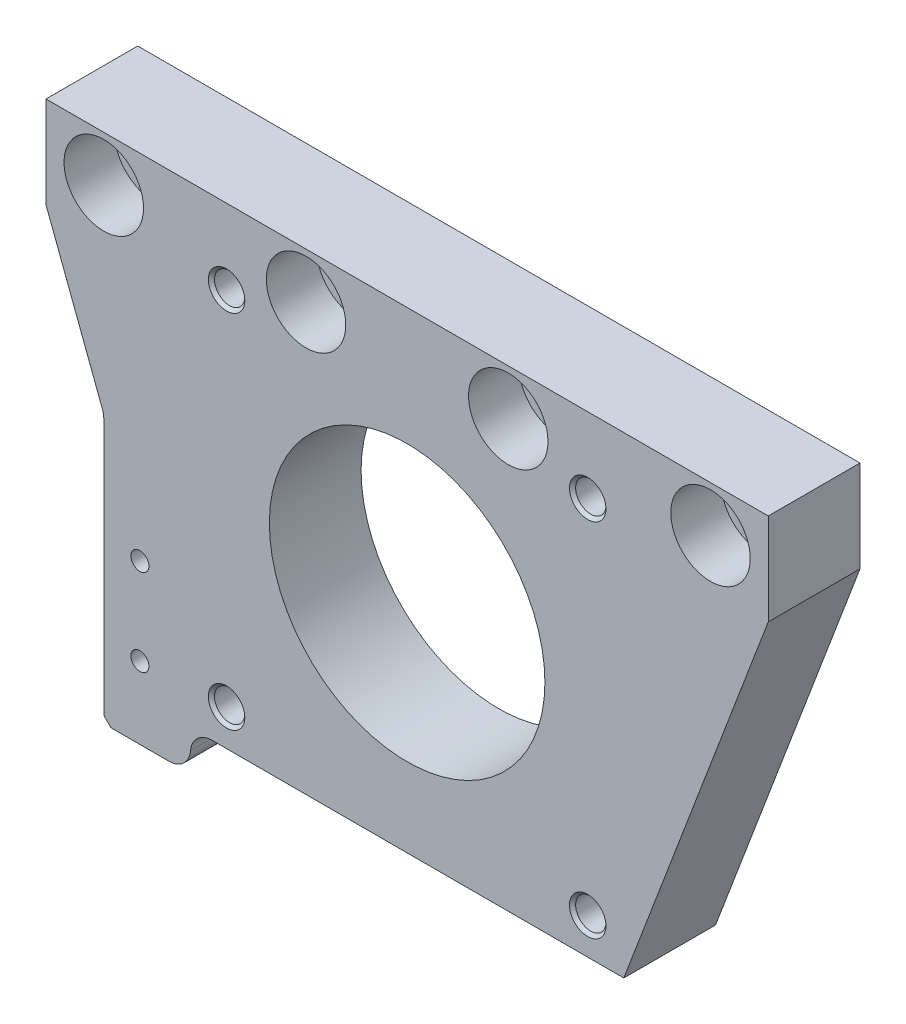
ISO-10303-21;
HEADER;
FILE_DESCRIPTION(('STEP AP214'),'2;1');
FILE_NAME('part.step','',(''),(''),'','','');
FILE_SCHEMA(('AUTOMOTIVE_DESIGN { 1 0 10303 214 1 1 1 1 }'));
ENDSEC;
DATA;
#1=APPLICATION_CONTEXT('core data for automotive mechanical design processes');
#2=APPLICATION_PROTOCOL_DEFINITION('international standard','automotive_design',2000,#1);
#3=PRODUCT_CONTEXT('',#1,'mechanical');
#4=PRODUCT('Part','Part','',(#3));
#5=PRODUCT_RELATED_PRODUCT_CATEGORY('part','',(#4));
#6=PRODUCT_DEFINITION_FORMATION('','',#4);
#7=PRODUCT_DEFINITION_CONTEXT('part definition',#1,'design');
#8=PRODUCT_DEFINITION('design','',#6,#7);
#9=PRODUCT_DEFINITION_SHAPE('','',#8);
#10=(LENGTH_UNIT() NAMED_UNIT(*) SI_UNIT(.MILLI.,.METRE.));
#11=(NAMED_UNIT(*) PLANE_ANGLE_UNIT() SI_UNIT($,.RADIAN.));
#12=(NAMED_UNIT(*) SI_UNIT($,.STERADIAN.) SOLID_ANGLE_UNIT());
#13=UNCERTAINTY_MEASURE_WITH_UNIT(LENGTH_MEASURE(1.E-05),#10,'distance_accuracy_value','');
#14=(GEOMETRIC_REPRESENTATION_CONTEXT(3) GLOBAL_UNCERTAINTY_ASSIGNED_CONTEXT((#13)) GLOBAL_UNIT_ASSIGNED_CONTEXT((#10,
#11,#12)) REPRESENTATION_CONTEXT('',''));
#15=CARTESIAN_POINT('',(0.,0.,0.));
#16=DIRECTION('',(0.,0.,1.));
#17=DIRECTION('',(1.,0.,0.));
#18=AXIS2_PLACEMENT_3D('',#15,#16,#17);
#19=CARTESIAN_POINT('',(-50.0000000000009,22.7000000000002,-12.6999999999999));
#20=DIRECTION('',(-0.934936655566325,-0.354814670044142,0.));
#21=DIRECTION('',(0.354814670044142,-0.934936655566325,0.));
#22=AXIS2_PLACEMENT_3D('',#19,#20,#21);
#23=PLANE('',#22);
#24=DIRECTION('',(0.354814670044142,-0.934936655566325,0.));
#25=VECTOR('',#24,1.);
#26=CARTESIAN_POINT('',(-50.0000000000009,22.7000000000002,-12.6999999999999));
#27=LINE('',#26,#25);
#28=CARTESIAN_POINT('',(-50.0000000000009,22.7000000000002,-12.6999999999999));
#29=VERTEX_POINT('',#28);
#30=CARTESIAN_POINT('',(-42.1951900333016,2.13432573774847,-12.6999999999999));
#31=VERTEX_POINT('',#30);
#32=EDGE_CURVE('E157',#29,#31,#27,.T.);
#33=ORIENTED_EDGE('',*,*,#32,.T.);
#34=DIRECTION('',(0.,0.,1.));
#35=VECTOR('',#34,1.);
#36=CARTESIAN_POINT('',(-42.1951900333016,2.13432573774847,0.));
#37=LINE('',#36,#35);
#38=CARTESIAN_POINT('',(-42.1951900333016,2.13432573774847,0.));
#39=VERTEX_POINT('',#38);
#40=EDGE_CURVE('E193',#31,#39,#37,.T.);
#41=ORIENTED_EDGE('',*,*,#40,.T.);
#42=DIRECTION('',(0.354814670044142,-0.934936655566325,0.));
#43=VECTOR('',#42,1.);
#44=CARTESIAN_POINT('',(-50.0000000000009,22.7000000000002,0.));
#45=LINE('',#44,#43);
#46=CARTESIAN_POINT('',(-50.0000000000009,22.7000000000002,0.));
#47=VERTEX_POINT('',#46);
#48=EDGE_CURVE('E149',#47,#39,#45,.T.);
#49=ORIENTED_EDGE('',*,*,#48,.F.);
#50=DIRECTION('',(0.,0.,1.));
#51=VECTOR('',#50,1.);
#52=CARTESIAN_POINT('',(-50.0000000000009,22.7000000000002,-12.6999999999999));
#53=LINE('',#52,#51);
#54=EDGE_CURVE('E191',#29,#47,#53,.T.);
#55=ORIENTED_EDGE('',*,*,#54,.F.);
#56=EDGE_LOOP('',(#33,#41,#49,#55));
#57=FACE_BOUND('',#56,.T.);
#58=ADVANCED_FACE('F48',(#57),#23,.T.);
#59=CARTESIAN_POINT('',(-42.0000000000005,29.0500000000003,-12.6999999999999));
#60=DIRECTION('',(0.,0.,1.));
#61=DIRECTION('',(1.00000000000004,0.,0.));
#62=AXIS2_PLACEMENT_3D('',#59,#60,#61);
#63=CYLINDRICAL_SURFACE('',#62,2.525);
#64=CARTESIAN_POINT('',(-42.0000000000005,29.0500000000003,-12.6999999999999));
#65=DIRECTION('',(0.,0.,1.));
#66=DIRECTION('',(1.00000000000004,0.,0.));
#67=AXIS2_PLACEMENT_3D('',#64,#65,#66);
#68=CIRCLE('',#67,2.525);
#69=CARTESIAN_POINT('',(-39.4750000000004,29.0500000000003,-12.6999999999999));
#70=VERTEX_POINT('',#69);
#71=EDGE_CURVE('E328',#70,#70,#68,.T.);
#72=ORIENTED_EDGE('',*,*,#71,.F.);
#73=EDGE_LOOP('',(#72));
#74=FACE_BOUND('',#73,.T.);
#75=CARTESIAN_POINT('',(-42.0000000000005,29.0500000000003,-6.9999999999999));
#76=DIRECTION('',(0.,0.,1.));
#77=DIRECTION('',(1.00000000000004,0.,0.));
#78=AXIS2_PLACEMENT_3D('',#75,#76,#77);
#79=CIRCLE('',#78,2.525);
#80=CARTESIAN_POINT('',(-39.4750000000004,29.0500000000003,-6.9999999999999));
#81=VERTEX_POINT('',#80);
#82=EDGE_CURVE('E209',#81,#81,#79,.F.);
#83=ORIENTED_EDGE('',*,*,#82,.F.);
#84=EDGE_LOOP('',(#83));
#85=FACE_BOUND('',#84,.T.);
#86=ADVANCED_FACE('F354',(#74,#85),#63,.F.);
#87=CARTESIAN_POINT('',(42.0000000000035,29.0499999999973,-12.6999999999999));
#88=DIRECTION('',(0.,0.,1.));
#89=DIRECTION('',(1.00000000000004,0.,0.));
#90=AXIS2_PLACEMENT_3D('',#87,#88,#89);
#91=CYLINDRICAL_SURFACE('',#90,2.525);
#92=CARTESIAN_POINT('',(42.0000000000035,29.0499999999973,-12.6999999999999));
#93=DIRECTION('',(0.,0.,1.));
#94=DIRECTION('',(-1.00000000000004,0.,0.));
#95=AXIS2_PLACEMENT_3D('',#92,#93,#94);
#96=CIRCLE('',#95,2.525);
#97=CARTESIAN_POINT('',(39.4750000000034,29.0499999999973,-12.6999999999999));
#98=VERTEX_POINT('',#97);
#99=EDGE_CURVE('E325',#98,#98,#96,.T.);
#100=ORIENTED_EDGE('',*,*,#99,.F.);
#101=EDGE_LOOP('',(#100));
#102=FACE_BOUND('',#101,.T.);
#103=CARTESIAN_POINT('',(42.0000000000035,29.0499999999973,-6.9999999999999));
#104=DIRECTION('',(0.,0.,1.));
#105=DIRECTION('',(1.00000000000004,0.,0.));
#106=AXIS2_PLACEMENT_3D('',#103,#104,#105);
#107=CIRCLE('',#106,2.525);
#108=CARTESIAN_POINT('',(44.5250000000036,29.0499999999973,-6.9999999999999));
#109=VERTEX_POINT('',#108);
#110=EDGE_CURVE('E206',#109,#109,#107,.F.);
#111=ORIENTED_EDGE('',*,*,#110,.F.);
#112=EDGE_LOOP('',(#111));
#113=FACE_BOUND('',#112,.T.);
#114=ADVANCED_FACE('F359',(#102,#113),#91,.F.);
#115=CARTESIAN_POINT('',(-14.0000000000002,29.0500000000004,-12.6999999999999));
#116=DIRECTION('',(0.,0.,1.));
#117=DIRECTION('',(1.00000000000004,0.,0.));
#118=AXIS2_PLACEMENT_3D('',#115,#116,#117);
#119=CYLINDRICAL_SURFACE('',#118,2.525);
#120=CARTESIAN_POINT('',(-14.0000000000002,29.0500000000004,-12.6999999999999));
#121=DIRECTION('',(0.,0.,1.));
#122=DIRECTION('',(1.00000000000004,0.,0.));
#123=AXIS2_PLACEMENT_3D('',#120,#121,#122);
#124=CIRCLE('',#123,2.525);
#125=CARTESIAN_POINT('',(-11.4750000000001,29.0500000000004,-12.6999999999999));
#126=VERTEX_POINT('',#125);
#127=EDGE_CURVE('E322',#126,#126,#124,.T.);
#128=ORIENTED_EDGE('',*,*,#127,.F.);
#129=EDGE_LOOP('',(#128));
#130=FACE_BOUND('',#129,.T.);
#131=CARTESIAN_POINT('',(-14.0000000000002,29.0500000000004,-6.9999999999999));
#132=DIRECTION('',(0.,0.,1.));
#133=DIRECTION('',(1.00000000000004,0.,0.));
#134=AXIS2_PLACEMENT_3D('',#131,#132,#133);
#135=CIRCLE('',#134,2.525);
#136=CARTESIAN_POINT('',(-11.4750000000001,29.0500000000004,-6.9999999999999));
#137=VERTEX_POINT('',#136);
#138=EDGE_CURVE('E202',#137,#137,#135,.F.);
#139=ORIENTED_EDGE('',*,*,#138,.F.);
#140=EDGE_LOOP('',(#139));
#141=FACE_BOUND('',#140,.T.);
#142=ADVANCED_FACE('F482',(#130,#141),#119,.F.);
#143=CARTESIAN_POINT('',(14.0000000000002,29.0500000000004,-12.6999999999999));
#144=DIRECTION('',(0.,0.,1.));
#145=DIRECTION('',(1.00000000000004,0.,0.));
#146=AXIS2_PLACEMENT_3D('',#143,#144,#145);
#147=CYLINDRICAL_SURFACE('',#146,2.525);
#148=CARTESIAN_POINT('',(14.0000000000002,29.0500000000004,-12.6999999999999));
#149=DIRECTION('',(0.,0.,1.));
#150=DIRECTION('',(-1.00000000000004,0.,0.));
#151=AXIS2_PLACEMENT_3D('',#148,#149,#150);
#152=CIRCLE('',#151,2.525);
#153=CARTESIAN_POINT('',(11.4750000000001,29.0500000000004,-12.6999999999999));
#154=VERTEX_POINT('',#153);
#155=EDGE_CURVE('E319',#154,#154,#152,.T.);
#156=ORIENTED_EDGE('',*,*,#155,.F.);
#157=EDGE_LOOP('',(#156));
#158=FACE_BOUND('',#157,.T.);
#159=CARTESIAN_POINT('',(14.0000000000002,29.0500000000004,-6.9999999999999));
#160=DIRECTION('',(0.,0.,1.));
#161=DIRECTION('',(1.00000000000004,0.,0.));
#162=AXIS2_PLACEMENT_3D('',#159,#160,#161);
#163=CIRCLE('',#162,2.525);
#164=CARTESIAN_POINT('',(16.5250000000003,29.0500000000004,-6.9999999999999));
#165=VERTEX_POINT('',#164);
#166=EDGE_CURVE('E199',#165,#165,#163,.F.);
#167=ORIENTED_EDGE('',*,*,#166,.F.);
#168=EDGE_LOOP('',(#167));
#169=FACE_BOUND('',#168,.T.);
#170=ADVANCED_FACE('F379',(#158,#169),#147,.F.);
#171=CARTESIAN_POINT('',(-30.0000000000004,-30.0000000000008,-12.6999999999999));
#172=DIRECTION('',(0.,-1.00000000000004,0.));
#173=DIRECTION('',(1.00000000000004,0.,0.));
#174=AXIS2_PLACEMENT_3D('',#171,#172,#173);
#175=PLANE('',#174);
#176=DIRECTION('',(1.00000000000004,0.,0.));
#177=VECTOR('',#176,1.);
#178=CARTESIAN_POINT('',(-30.0000000000004,-30.0000000000008,0.));
#179=LINE('',#178,#177);
#180=CARTESIAN_POINT('',(-27.0000000000004,-30.0000000000008,0.));
#181=VERTEX_POINT('',#180);
#182=CARTESIAN_POINT('',(30.0000000000004,-30.,0.));
#183=VERTEX_POINT('',#182);
#184=EDGE_CURVE('E176',#181,#183,#179,.T.);
#185=ORIENTED_EDGE('',*,*,#184,.F.);
#186=DIRECTION('',(0.,0.,1.));
#187=VECTOR('',#186,1.);
#188=CARTESIAN_POINT('',(-27.0000000000004,-30.0000000000008,-12.6999999999999));
#189=LINE('',#188,#187);
#190=CARTESIAN_POINT('',(-27.0000000000004,-30.0000000000008,-12.6999999999999));
#191=VERTEX_POINT('',#190);
#192=EDGE_CURVE('E143',#181,#191,#189,.F.);
#193=ORIENTED_EDGE('',*,*,#192,.T.);
#194=DIRECTION('',(1.00000000000004,0.,0.));
#195=VECTOR('',#194,1.);
#196=CARTESIAN_POINT('',(-30.0000000000004,-30.0000000000008,-12.6999999999999));
#197=LINE('',#196,#195);
#198=CARTESIAN_POINT('',(30.0000000000004,-30.,-12.6999999999999));
#199=VERTEX_POINT('',#198);
#200=EDGE_CURVE('E136',#191,#199,#197,.T.);
#201=ORIENTED_EDGE('',*,*,#200,.T.);
#202=DIRECTION('',(0.,0.,1.));
#203=VECTOR('',#202,1.);
#204=CARTESIAN_POINT('',(30.0000000000004,-30.,-12.6999999999999));
#205=LINE('',#204,#203);
#206=EDGE_CURVE('E140',#199,#183,#205,.T.);
#207=ORIENTED_EDGE('',*,*,#206,.T.);
#208=EDGE_LOOP('',(#185,#193,#201,#207));
#209=FACE_BOUND('',#208,.T.);
#210=ADVANCED_FACE('F139',(#209),#175,.T.);
#211=CARTESIAN_POINT('',(-50.0000000000009,35.4000000000004,-12.6999999999999));
#212=DIRECTION('',(-1.00000000000004,0.,0.));
#213=DIRECTION('',(0.,0.,1.));
#214=AXIS2_PLACEMENT_3D('',#211,#212,#213);
#215=PLANE('',#214);
#216=DIRECTION('',(0.,-1.00000000000004,0.));
#217=VECTOR('',#216,1.);
#218=CARTESIAN_POINT('',(-50.0000000000009,35.4000000000004,0.));
#219=LINE('',#218,#217);
#220=CARTESIAN_POINT('',(-50.0000000000009,35.4000000000004,0.));
#221=VERTEX_POINT('',#220);
#222=EDGE_CURVE('E186',#221,#47,#219,.T.);
#223=ORIENTED_EDGE('',*,*,#222,.F.);
#224=DIRECTION('',(0.,0.,1.));
#225=VECTOR('',#224,1.);
#226=CARTESIAN_POINT('',(-50.0000000000009,35.4000000000004,-12.6999999999999));
#227=LINE('',#226,#225);
#228=CARTESIAN_POINT('',(-50.0000000000009,35.4000000000004,-12.6999999999999));
#229=VERTEX_POINT('',#228);
#230=EDGE_CURVE('E194',#229,#221,#227,.T.);
#231=ORIENTED_EDGE('',*,*,#230,.F.);
#232=DIRECTION('',(0.,-1.00000000000004,0.));
#233=VECTOR('',#232,1.);
#234=CARTESIAN_POINT('',(-50.0000000000009,35.4000000000004,-12.6999999999999));
#235=LINE('',#234,#233);
#236=EDGE_CURVE('E171',#229,#29,#235,.T.);
#237=ORIENTED_EDGE('',*,*,#236,.T.);
#238=ORIENTED_EDGE('',*,*,#54,.T.);
#239=EDGE_LOOP('',(#223,#231,#237,#238));
#240=FACE_BOUND('',#239,.T.);
#241=ADVANCED_FACE('F363',(#240),#215,.T.);
#242=CARTESIAN_POINT('',(-50.0000000000009,35.4000000000004,-12.6999999999999));
#243=DIRECTION('',(0.,1.00000000000004,0.));
#244=DIRECTION('',(0.,0.,1.));
#245=AXIS2_PLACEMENT_3D('',#242,#243,#244);
#246=PLANE('',#245);
#247=DIRECTION('',(-1.00000000000004,0.,0.));
#248=VECTOR('',#247,1.);
#249=CARTESIAN_POINT('',(-50.0000000000009,35.4000000000004,0.));
#250=LINE('',#249,#248);
#251=CARTESIAN_POINT('',(50.0000000000039,35.3999999999973,0.));
#252=VERTEX_POINT('',#251);
#253=EDGE_CURVE('E183',#252,#221,#250,.T.);
#254=ORIENTED_EDGE('',*,*,#253,.F.);
#255=DIRECTION('',(0.,0.,1.));
#256=VECTOR('',#255,1.);
#257=CARTESIAN_POINT('',(50.0000000000039,35.3999999999973,-12.6999999999999));
#258=LINE('',#257,#256);
#259=CARTESIAN_POINT('',(50.0000000000039,35.3999999999973,-12.6999999999999));
#260=VERTEX_POINT('',#259);
#261=EDGE_CURVE('E196',#260,#252,#258,.T.);
#262=ORIENTED_EDGE('',*,*,#261,.F.);
#263=DIRECTION('',(-1.00000000000004,0.,0.));
#264=VECTOR('',#263,1.);
#265=CARTESIAN_POINT('',(-50.0000000000009,35.4000000000004,-12.6999999999999));
#266=LINE('',#265,#264);
#267=EDGE_CURVE('E165',#260,#229,#266,.T.);
#268=ORIENTED_EDGE('',*,*,#267,.T.);
#269=ORIENTED_EDGE('',*,*,#230,.T.);
#270=EDGE_LOOP('',(#254,#262,#268,#269));
#271=FACE_BOUND('',#270,.T.);
#272=ADVANCED_FACE('F366',(#271),#246,.T.);
#273=CARTESIAN_POINT('',(50.0000000000039,22.6999999999972,-12.6999999999999));
#274=DIRECTION('',(1.00000000000004,0.,0.));
#275=DIRECTION('',(0.,0.,-1.));
#276=AXIS2_PLACEMENT_3D('',#273,#274,#275);
#277=PLANE('',#276);
#278=DIRECTION('',(0.,1.00000000000004,0.));
#279=VECTOR('',#278,1.);
#280=CARTESIAN_POINT('',(50.0000000000039,22.6999999999972,0.));
#281=LINE('',#280,#279);
#282=CARTESIAN_POINT('',(50.0000000000039,22.6999999999972,0.));
#283=VERTEX_POINT('',#282);
#284=EDGE_CURVE('E180',#283,#252,#281,.T.);
#285=ORIENTED_EDGE('',*,*,#284,.F.);
#286=DIRECTION('',(0.,0.,1.));
#287=VECTOR('',#286,1.);
#288=CARTESIAN_POINT('',(50.0000000000039,22.6999999999972,-12.6999999999999));
#289=LINE('',#288,#287);
#290=CARTESIAN_POINT('',(50.0000000000039,22.6999999999972,-12.6999999999999));
#291=VERTEX_POINT('',#290);
#292=EDGE_CURVE('E156',#291,#283,#289,.T.);
#293=ORIENTED_EDGE('',*,*,#292,.F.);
#294=DIRECTION('',(0.,1.00000000000004,0.));
#295=VECTOR('',#294,1.);
#296=CARTESIAN_POINT('',(50.0000000000039,22.6999999999972,-12.6999999999999));
#297=LINE('',#296,#295);
#298=EDGE_CURVE('E163',#291,#260,#297,.T.);
#299=ORIENTED_EDGE('',*,*,#298,.T.);
#300=ORIENTED_EDGE('',*,*,#261,.T.);
#301=EDGE_LOOP('',(#285,#293,#299,#300));
#302=FACE_BOUND('',#301,.T.);
#303=ADVANCED_FACE('F370',(#302),#277,.T.);
#304=CARTESIAN_POINT('',(30.0000000000004,-30.,-12.6999999999999));
#305=DIRECTION('',(0.934936655566325,-0.354814670044142,0.));
#306=DIRECTION('',(0.354814670044142,0.934936655566325,0.));
#307=AXIS2_PLACEMENT_3D('',#304,#305,#306);
#308=PLANE('',#307);
#309=DIRECTION('',(0.354814670044142,0.934936655566325,0.));
#310=VECTOR('',#309,1.);
#311=CARTESIAN_POINT('',(30.0000000000004,-30.,0.));
#312=LINE('',#311,#310);
#313=EDGE_CURVE('E155',#183,#283,#312,.T.);
#314=ORIENTED_EDGE('',*,*,#313,.F.);
#315=ORIENTED_EDGE('',*,*,#206,.F.);
#316=DIRECTION('',(0.354814670044142,0.934936655566325,0.));
#317=VECTOR('',#316,1.);
#318=CARTESIAN_POINT('',(30.0000000000004,-30.,-12.6999999999999));
#319=LINE('',#318,#317);
#320=EDGE_CURVE('E148',#199,#291,#319,.T.);
#321=ORIENTED_EDGE('',*,*,#320,.T.);
#322=ORIENTED_EDGE('',*,*,#292,.T.);
#323=EDGE_LOOP('',(#314,#315,#321,#322));
#324=FACE_BOUND('',#323,.T.);
#325=ADVANCED_FACE('F153',(#324),#308,.T.);
#326=CARTESIAN_POINT('',(0.,0.,-12.6999999999999));
#327=DIRECTION('',(0.,0.,1.));
#328=DIRECTION('',(1.00000000000004,0.,0.));
#329=AXIS2_PLACEMENT_3D('',#326,#327,#328);
#330=PLANE('',#329);
#331=CARTESIAN_POINT('',(-37.0000000000006,-13.5000000000004,-12.6999999999999));
#332=DIRECTION('',(0.,0.,1.));
#333=DIRECTION('',(1.00000000000004,0.,0.));
#334=AXIS2_PLACEMENT_3D('',#331,#332,#333);
#335=CIRCLE('',#334,1.24999999999999);
#336=CARTESIAN_POINT('',(-35.7500000000006,-13.5000000000004,-12.6999999999999));
#337=VERTEX_POINT('',#336);
#338=EDGE_CURVE('E667',#337,#337,#335,.T.);
#339=ORIENTED_EDGE('',*,*,#338,.T.);
#340=EDGE_LOOP('',(#339));
#341=FACE_BOUND('',#340,.T.);
#342=CARTESIAN_POINT('',(-37.0000000000004,-25.5000000000004,-12.6999999999999));
#343=DIRECTION('',(0.,0.,1.));
#344=DIRECTION('',(1.00000000000004,0.,0.));
#345=AXIS2_PLACEMENT_3D('',#342,#343,#344);
#346=CIRCLE('',#345,1.24999999999999);
#347=CARTESIAN_POINT('',(-35.7500000000003,-25.5000000000004,-12.6999999999999));
#348=VERTEX_POINT('',#347);
#349=EDGE_CURVE('E251',#348,#348,#346,.T.);
#350=ORIENTED_EDGE('',*,*,#349,.T.);
#351=EDGE_LOOP('',(#350));
#352=FACE_BOUND('',#351,.T.);
#353=CARTESIAN_POINT('',(-25.0000000000005,25.0000000000003,-12.6999999999999));
#354=DIRECTION('',(0.,0.,1.));
#355=DIRECTION('',(1.00000000000004,0.,0.));
#356=AXIS2_PLACEMENT_3D('',#353,#354,#355);
#357=CIRCLE('',#356,2.1);
#358=CARTESIAN_POINT('',(-22.9000000000005,25.0000000000003,-12.6999999999999));
#359=VERTEX_POINT('',#358);
#360=EDGE_CURVE('E289',#359,#359,#357,.T.);
#361=ORIENTED_EDGE('',*,*,#360,.T.);
#362=EDGE_LOOP('',(#361));
#363=FACE_BOUND('',#362,.T.);
#364=CARTESIAN_POINT('',(25.0000000000003,25.0000000000004,-12.6999999999999));
#365=DIRECTION('',(0.,0.,1.));
#366=DIRECTION('',(1.00000000000004,0.,0.));
#367=AXIS2_PLACEMENT_3D('',#364,#365,#366);
#368=CIRCLE('',#367,2.1);
#369=CARTESIAN_POINT('',(27.1000000000004,25.0000000000004,-12.6999999999999));
#370=VERTEX_POINT('',#369);
#371=EDGE_CURVE('E298',#370,#370,#368,.T.);
#372=ORIENTED_EDGE('',*,*,#371,.T.);
#373=EDGE_LOOP('',(#372));
#374=FACE_BOUND('',#373,.T.);
#375=CARTESIAN_POINT('',(25.0000000000004,-25.0000000000004,-12.6999999999999));
#376=DIRECTION('',(0.,0.,1.));
#377=DIRECTION('',(1.00000000000004,0.,0.));
#378=AXIS2_PLACEMENT_3D('',#375,#376,#377);
#379=CIRCLE('',#378,2.1);
#380=CARTESIAN_POINT('',(27.1000000000005,-25.0000000000004,-12.6999999999999));
#381=VERTEX_POINT('',#380);
#382=EDGE_CURVE('E307',#381,#381,#379,.T.);
#383=ORIENTED_EDGE('',*,*,#382,.T.);
#384=EDGE_LOOP('',(#383));
#385=FACE_BOUND('',#384,.T.);
#386=CARTESIAN_POINT('',(-25.0000000000004,-25.0000000000004,-12.6999999999999));
#387=DIRECTION('',(0.,0.,1.));
#388=DIRECTION('',(1.00000000000004,0.,0.));
#389=AXIS2_PLACEMENT_3D('',#386,#387,#388);
#390=CIRCLE('',#389,2.1);
#391=CARTESIAN_POINT('',(-22.9000000000003,-25.0000000000004,-12.6999999999999));
#392=VERTEX_POINT('',#391);
#393=EDGE_CURVE('E316',#392,#392,#390,.T.);
#394=ORIENTED_EDGE('',*,*,#393,.T.);
#395=EDGE_LOOP('',(#394));
#396=FACE_BOUND('',#395,.T.);
#397=ORIENTED_EDGE('',*,*,#155,.T.);
#398=EDGE_LOOP('',(#397));
#399=FACE_BOUND('',#398,.T.);
#400=ORIENTED_EDGE('',*,*,#127,.T.);
#401=EDGE_LOOP('',(#400));
#402=FACE_BOUND('',#401,.T.);
#403=ORIENTED_EDGE('',*,*,#99,.T.);
#404=EDGE_LOOP('',(#403));
#405=FACE_BOUND('',#404,.T.);
#406=ORIENTED_EDGE('',*,*,#71,.T.);
#407=EDGE_LOOP('',(#406));
#408=FACE_BOUND('',#407,.T.);
#409=CARTESIAN_POINT('',(0.,0.,-12.6999999999999));
#410=DIRECTION('',(0.,0.,1.));
#411=DIRECTION('',(1.00000000000004,0.,0.));
#412=AXIS2_PLACEMENT_3D('',#409,#410,#411);
#413=CIRCLE('',#412,19.075);
#414=CARTESIAN_POINT('',(19.0750000000007,0.,-12.6999999999999));
#415=VERTEX_POINT('',#414);
#416=EDGE_CURVE('E178',#415,#415,#413,.T.);
#417=ORIENTED_EDGE('',*,*,#416,.T.);
#418=EDGE_LOOP('',(#417));
#419=FACE_BOUND('',#418,.T.);
#420=DIRECTION('',(-1.00000000000004,0.,0.));
#421=VECTOR('',#420,1.);
#422=CARTESIAN_POINT('',(-30.0000000000005,-35.5000000000008,-12.6999999999999));
#423=LINE('',#422,#421);
#424=CARTESIAN_POINT('',(-32.9791303715511,-35.5000000000001,-12.6999999999999));
#425=VERTEX_POINT('',#424);
#426=CARTESIAN_POINT('',(-41.0000000000004,-35.5000000000001,-12.6999999999999));
#427=VERTEX_POINT('',#426);
#428=EDGE_CURVE('E253',#425,#427,#423,.T.);
#429=ORIENTED_EDGE('',*,*,#428,.T.);
#430=DIRECTION('',(0.707106781186572,-0.707106781186562,0.));
#431=VECTOR('',#430,1.);
#432=CARTESIAN_POINT('',(-42.0000000000004,-34.5000000000001,-12.6999999999999));
#433=LINE('',#432,#431);
#434=CARTESIAN_POINT('',(-42.0000000000004,-34.5000000000001,-12.6999999999999));
#435=VERTEX_POINT('',#434);
#436=EDGE_CURVE('E13',#427,#435,#433,.F.);
#437=ORIENTED_EDGE('',*,*,#436,.T.);
#438=DIRECTION('',(0.,1.00000000000004,0.));
#439=VECTOR('',#438,1.);
#440=CARTESIAN_POINT('',(-42.0000000000004,-35.5000000000001,-12.6999999999999));
#441=LINE('',#440,#439);
#442=CARTESIAN_POINT('',(-42.0000000000004,1.06988172761607,-12.6999999999999));
#443=VERTEX_POINT('',#442);
#444=EDGE_CURVE('E246',#435,#443,#441,.T.);
#445=ORIENTED_EDGE('',*,*,#444,.T.);
#446=CARTESIAN_POINT('',(-45.0000000000004,1.06988172761607,-12.6999999999999));
#447=DIRECTION('',(0.,0.,1.));
#448=DIRECTION('',(1.00000000000004,0.,0.));
#449=AXIS2_PLACEMENT_3D('',#446,#447,#448);
#450=CIRCLE('',#449,3.);
#451=EDGE_CURVE('E221',#443,#31,#450,.T.);
#452=ORIENTED_EDGE('',*,*,#451,.T.);
#453=ORIENTED_EDGE('',*,*,#32,.F.);
#454=ORIENTED_EDGE('',*,*,#236,.F.);
#455=ORIENTED_EDGE('',*,*,#267,.F.);
#456=ORIENTED_EDGE('',*,*,#298,.F.);
#457=ORIENTED_EDGE('',*,*,#320,.F.);
#458=ORIENTED_EDGE('',*,*,#200,.F.);
#459=CARTESIAN_POINT('',(-27.0000000000004,-33.0000000000008,-12.6999999999999));
#460=DIRECTION('',(0.,0.,1.));
#461=DIRECTION('',(1.00000000000004,0.,0.));
#462=AXIS2_PLACEMENT_3D('',#459,#460,#461);
#463=CIRCLE('',#462,3.);
#464=CARTESIAN_POINT('',(-29.9895651857758,-32.7500000000009,-12.6999999999999));
#465=VERTEX_POINT('',#464);
#466=EDGE_CURVE('E225',#191,#465,#463,.T.);
#467=ORIENTED_EDGE('',*,*,#466,.T.);
#468=CARTESIAN_POINT('',(-32.9791303715511,-32.5000000000001,-12.6999999999999));
#469=DIRECTION('',(0.,0.,1.));
#470=DIRECTION('',(1.00000000000004,0.,0.));
#471=AXIS2_PLACEMENT_3D('',#468,#469,#470);
#472=CIRCLE('',#471,3.);
#473=EDGE_CURVE('E234',#465,#425,#472,.F.);
#474=ORIENTED_EDGE('',*,*,#473,.T.);
#475=EDGE_LOOP('',(#429,#437,#445,#452,#453,#454,#455,#456,#457,#458,#467,#474));
#476=FACE_BOUND('',#475,.T.);
#477=ADVANCED_FACE('F160',(#341,#352,#363,#374,#385,#396,#399,#402,#405,#408,#419,#476),#330,.F.);
#478=CARTESIAN_POINT('',(0.,0.,0.));
#479=DIRECTION('',(0.,0.,1.));
#480=DIRECTION('',(1.00000000000004,0.,0.));
#481=AXIS2_PLACEMENT_3D('',#478,#479,#480);
#482=PLANE('',#481);
#483=CARTESIAN_POINT('',(-37.0000000000006,-13.5000000000004,0.));
#484=DIRECTION('',(0.,0.,1.));
#485=DIRECTION('',(1.00000000000004,0.,0.));
#486=AXIS2_PLACEMENT_3D('',#483,#484,#485);
#487=CIRCLE('',#486,1.24999999999999);
#488=CARTESIAN_POINT('',(-35.7500000000006,-13.5000000000004,0.));
#489=VERTEX_POINT('',#488);
#490=EDGE_CURVE('E669',#489,#489,#487,.T.);
#491=ORIENTED_EDGE('',*,*,#490,.F.);
#492=EDGE_LOOP('',(#491));
#493=FACE_BOUND('',#492,.T.);
#494=CARTESIAN_POINT('',(-37.0000000000004,-25.5000000000004,0.));
#495=DIRECTION('',(0.,0.,1.));
#496=DIRECTION('',(1.00000000000004,0.,0.));
#497=AXIS2_PLACEMENT_3D('',#494,#495,#496);
#498=CIRCLE('',#497,1.24999999999999);
#499=CARTESIAN_POINT('',(-35.7500000000004,-25.5000000000004,0.));
#500=VERTEX_POINT('',#499);
#501=EDGE_CURVE('E256',#500,#500,#498,.T.);
#502=ORIENTED_EDGE('',*,*,#501,.F.);
#503=EDGE_LOOP('',(#502));
#504=FACE_BOUND('',#503,.T.);
#505=CARTESIAN_POINT('',(-42.0000000000005,29.0500000000003,0.));
#506=DIRECTION('',(0.,0.,1.));
#507=DIRECTION('',(1.00000000000004,0.,0.));
#508=AXIS2_PLACEMENT_3D('',#505,#506,#507);
#509=CIRCLE('',#508,5.5);
#510=CARTESIAN_POINT('',(-36.5000000000002,29.0500000000003,0.));
#511=VERTEX_POINT('',#510);
#512=EDGE_CURVE('E264',#511,#511,#509,.T.);
#513=ORIENTED_EDGE('',*,*,#512,.F.);
#514=EDGE_LOOP('',(#513));
#515=FACE_BOUND('',#514,.T.);
#516=CARTESIAN_POINT('',(-14.0000000000002,29.0500000000004,0.));
#517=DIRECTION('',(0.,0.,1.));
#518=DIRECTION('',(1.00000000000004,0.,0.));
#519=AXIS2_PLACEMENT_3D('',#516,#517,#518);
#520=CIRCLE('',#519,5.5);
#521=CARTESIAN_POINT('',(-8.50000000000001,29.0500000000004,0.));
#522=VERTEX_POINT('',#521);
#523=EDGE_CURVE('E270',#522,#522,#520,.T.);
#524=ORIENTED_EDGE('',*,*,#523,.F.);
#525=EDGE_LOOP('',(#524));
#526=FACE_BOUND('',#525,.T.);
#527=CARTESIAN_POINT('',(14.0000000000002,29.0500000000004,0.));
#528=DIRECTION('',(0.,0.,1.));
#529=DIRECTION('',(1.00000000000004,0.,0.));
#530=AXIS2_PLACEMENT_3D('',#527,#528,#529);
#531=CIRCLE('',#530,5.5);
#532=CARTESIAN_POINT('',(19.5000000000004,29.0500000000004,0.));
#533=VERTEX_POINT('',#532);
#534=EDGE_CURVE('E276',#533,#533,#531,.T.);
#535=ORIENTED_EDGE('',*,*,#534,.F.);
#536=EDGE_LOOP('',(#535));
#537=FACE_BOUND('',#536,.T.);
#538=CARTESIAN_POINT('',(42.0000000000035,29.0499999999973,0.));
#539=DIRECTION('',(0.,0.,1.));
#540=DIRECTION('',(1.00000000000004,0.,0.));
#541=AXIS2_PLACEMENT_3D('',#538,#539,#540);
#542=CIRCLE('',#541,5.5);
#543=CARTESIAN_POINT('',(47.5000000000037,29.0499999999973,0.));
#544=VERTEX_POINT('',#543);
#545=EDGE_CURVE('E261',#544,#544,#542,.T.);
#546=ORIENTED_EDGE('',*,*,#545,.F.);
#547=EDGE_LOOP('',(#546));
#548=FACE_BOUND('',#547,.T.);
#549=CARTESIAN_POINT('',(-25.0000000000005,25.0000000000003,0.));
#550=DIRECTION('',(0.,0.,1.));
#551=DIRECTION('',(1.00000000000004,0.,0.));
#552=AXIS2_PLACEMENT_3D('',#549,#550,#551);
#553=CIRCLE('',#552,2.525);
#554=CARTESIAN_POINT('',(-22.4750000000004,25.0000000000003,0.));
#555=VERTEX_POINT('',#554);
#556=EDGE_CURVE('E212',#555,#555,#553,.T.);
#557=ORIENTED_EDGE('',*,*,#556,.F.);
#558=EDGE_LOOP('',(#557));
#559=FACE_BOUND('',#558,.T.);
#560=CARTESIAN_POINT('',(25.0000000000003,25.0000000000004,0.));
#561=DIRECTION('',(0.,0.,1.));
#562=DIRECTION('',(1.00000000000004,0.,0.));
#563=AXIS2_PLACEMENT_3D('',#560,#561,#562);
#564=CIRCLE('',#563,2.525);
#565=CARTESIAN_POINT('',(27.5250000000004,25.0000000000004,0.));
#566=VERTEX_POINT('',#565);
#567=EDGE_CURVE('E292',#566,#566,#564,.T.);
#568=ORIENTED_EDGE('',*,*,#567,.F.);
#569=EDGE_LOOP('',(#568));
#570=FACE_BOUND('',#569,.T.);
#571=CARTESIAN_POINT('',(25.0000000000004,-25.0000000000004,0.));
#572=DIRECTION('',(0.,0.,1.));
#573=DIRECTION('',(1.00000000000004,0.,0.));
#574=AXIS2_PLACEMENT_3D('',#571,#572,#573);
#575=CIRCLE('',#574,2.525);
#576=CARTESIAN_POINT('',(27.5250000000005,-25.0000000000004,0.));
#577=VERTEX_POINT('',#576);
#578=EDGE_CURVE('E301',#577,#577,#575,.T.);
#579=ORIENTED_EDGE('',*,*,#578,.F.);
#580=EDGE_LOOP('',(#579));
#581=FACE_BOUND('',#580,.T.);
#582=CARTESIAN_POINT('',(-25.0000000000004,-25.0000000000004,0.));
#583=DIRECTION('',(0.,0.,1.));
#584=DIRECTION('',(1.00000000000004,0.,0.));
#585=AXIS2_PLACEMENT_3D('',#582,#583,#584);
#586=CIRCLE('',#585,2.525);
#587=CARTESIAN_POINT('',(-22.4750000000003,-25.0000000000004,0.));
#588=VERTEX_POINT('',#587);
#589=EDGE_CURVE('E310',#588,#588,#586,.T.);
#590=ORIENTED_EDGE('',*,*,#589,.F.);
#591=EDGE_LOOP('',(#590));
#592=FACE_BOUND('',#591,.T.);
#593=CARTESIAN_POINT('',(0.,0.,0.));
#594=DIRECTION('',(0.,0.,1.));
#595=DIRECTION('',(1.00000000000004,0.,0.));
#596=AXIS2_PLACEMENT_3D('',#593,#594,#595);
#597=CIRCLE('',#596,19.075);
#598=CARTESIAN_POINT('',(19.0750000000007,0.,0.));
#599=VERTEX_POINT('',#598);
#600=EDGE_CURVE('E331',#599,#599,#597,.T.);
#601=ORIENTED_EDGE('',*,*,#600,.F.);
#602=EDGE_LOOP('',(#601));
#603=FACE_BOUND('',#602,.T.);
#604=DIRECTION('',(0.,-1.00000000000004,0.));
#605=VECTOR('',#604,1.);
#606=CARTESIAN_POINT('',(-42.0000000000004,-35.5000000000001,0.));
#607=LINE('',#606,#605);
#608=CARTESIAN_POINT('',(-42.0000000000004,1.06988172761607,0.));
#609=VERTEX_POINT('',#608);
#610=CARTESIAN_POINT('',(-42.0000000000004,-34.5000000000001,0.));
#611=VERTEX_POINT('',#610);
#612=EDGE_CURVE('E244',#609,#611,#607,.T.);
#613=ORIENTED_EDGE('',*,*,#612,.T.);
#614=DIRECTION('',(-0.707106781186572,0.707106781186562,0.));
#615=VECTOR('',#614,1.);
#616=CARTESIAN_POINT('',(-38.2500000000001,-38.2500000000003,0.));
#617=LINE('',#616,#615);
#618=CARTESIAN_POINT('',(-41.0000000000004,-35.5000000000001,0.));
#619=VERTEX_POINT('',#618);
#620=EDGE_CURVE('E70',#611,#619,#617,.F.);
#621=ORIENTED_EDGE('',*,*,#620,.T.);
#622=DIRECTION('',(1.00000000000004,0.,0.));
#623=VECTOR('',#622,1.);
#624=CARTESIAN_POINT('',(-30.0000000000005,-35.5000000000008,0.));
#625=LINE('',#624,#623);
#626=CARTESIAN_POINT('',(-32.9791303715511,-35.5000000000001,0.));
#627=VERTEX_POINT('',#626);
#628=EDGE_CURVE('E250',#619,#627,#625,.T.);
#629=ORIENTED_EDGE('',*,*,#628,.T.);
#630=CARTESIAN_POINT('',(-32.9791303715511,-32.5000000000001,0.));
#631=DIRECTION('',(0.,0.,1.));
#632=DIRECTION('',(1.00000000000004,0.,0.));
#633=AXIS2_PLACEMENT_3D('',#630,#631,#632);
#634=CIRCLE('',#633,3.);
#635=CARTESIAN_POINT('',(-29.9895651857758,-32.7500000000009,0.));
#636=VERTEX_POINT('',#635);
#637=EDGE_CURVE('E230',#627,#636,#634,.T.);
#638=ORIENTED_EDGE('',*,*,#637,.T.);
#639=CARTESIAN_POINT('',(-27.0000000000004,-33.0000000000008,0.));
#640=DIRECTION('',(0.,0.,1.));
#641=DIRECTION('',(1.00000000000004,0.,0.));
#642=AXIS2_PLACEMENT_3D('',#639,#640,#641);
#643=CIRCLE('',#642,3.);
#644=EDGE_CURVE('E223',#636,#181,#643,.F.);
#645=ORIENTED_EDGE('',*,*,#644,.T.);
#646=ORIENTED_EDGE('',*,*,#184,.T.);
#647=ORIENTED_EDGE('',*,*,#313,.T.);
#648=ORIENTED_EDGE('',*,*,#284,.T.);
#649=ORIENTED_EDGE('',*,*,#253,.T.);
#650=ORIENTED_EDGE('',*,*,#222,.T.);
#651=ORIENTED_EDGE('',*,*,#48,.T.);
#652=CARTESIAN_POINT('',(-45.0000000000004,1.06988172761607,0.));
#653=DIRECTION('',(0.,0.,1.));
#654=DIRECTION('',(1.00000000000004,0.,0.));
#655=AXIS2_PLACEMENT_3D('',#652,#653,#654);
#656=CIRCLE('',#655,3.);
#657=EDGE_CURVE('E219',#39,#609,#656,.F.);
#658=ORIENTED_EDGE('',*,*,#657,.T.);
#659=EDGE_LOOP('',(#613,#621,#629,#638,#645,#646,#647,#648,#649,#650,#651,#658));
#660=FACE_BOUND('',#659,.T.);
#661=ADVANCED_FACE('F249',(#493,#504,#515,#526,#537,#548,#559,#570,#581,#592,#603,#660),#482,.T.);
#662=CARTESIAN_POINT('',(0.,0.,-12.6999999999999));
#663=DIRECTION('',(0.,0.,1.));
#664=DIRECTION('',(1.00000000000004,0.,0.));
#665=AXIS2_PLACEMENT_3D('',#662,#663,#664);
#666=CYLINDRICAL_SURFACE('',#665,19.075);
#667=ORIENTED_EDGE('',*,*,#416,.F.);
#668=EDGE_LOOP('',(#667));
#669=FACE_BOUND('',#668,.T.);
#670=ORIENTED_EDGE('',*,*,#600,.T.);
#671=EDGE_LOOP('',(#670));
#672=FACE_BOUND('',#671,.T.);
#673=ADVANCED_FACE('F336',(#669,#672),#666,.F.);
#674=CARTESIAN_POINT('',(-25.0000000000004,-25.0000000000004,0.));
#675=DIRECTION('',(0.,0.,1.));
#676=DIRECTION('',(1.00000000000004,0.,0.));
#677=AXIS2_PLACEMENT_3D('',#674,#675,#676);
#678=CYLINDRICAL_SURFACE('',#677,2.1);
#679=ORIENTED_EDGE('',*,*,#393,.F.);
#680=EDGE_LOOP('',(#679));
#681=FACE_BOUND('',#680,.T.);
#682=CARTESIAN_POINT('',(-25.0000000000004,-25.0000000000004,-0.424999999999898));
#683=DIRECTION('',(0.,0.,1.));
#684=DIRECTION('',(1.00000000000004,0.,0.));
#685=AXIS2_PLACEMENT_3D('',#682,#683,#684);
#686=CIRCLE('',#685,2.1);
#687=CARTESIAN_POINT('',(-22.9000000000003,-25.0000000000004,-0.424999999999898));
#688=VERTEX_POINT('',#687);
#689=EDGE_CURVE('E313',#688,#688,#686,.T.);
#690=ORIENTED_EDGE('',*,*,#689,.T.);
#691=EDGE_LOOP('',(#690));
#692=FACE_BOUND('',#691,.T.);
#693=ADVANCED_FACE('F345',(#681,#692),#678,.F.);
#694=CARTESIAN_POINT('',(-25.0000000000004,-25.0000000000004,0.));
#695=DIRECTION('',(0.,0.,1.));
#696=DIRECTION('',(1.00000000000004,0.,0.));
#697=AXIS2_PLACEMENT_3D('',#694,#695,#696);
#698=CONICAL_SURFACE('',#697,2.525,0.78539816339745);
#699=ORIENTED_EDGE('',*,*,#689,.F.);
#700=EDGE_LOOP('',(#699));
#701=FACE_BOUND('',#700,.T.);
#702=ORIENTED_EDGE('',*,*,#589,.T.);
#703=EDGE_LOOP('',(#702));
#704=FACE_BOUND('',#703,.T.);
#705=ADVANCED_FACE('F472',(#701,#704),#698,.F.);
#706=CARTESIAN_POINT('',(25.0000000000004,-25.0000000000004,0.));
#707=DIRECTION('',(0.,0.,1.));
#708=DIRECTION('',(1.00000000000004,0.,0.));
#709=AXIS2_PLACEMENT_3D('',#706,#707,#708);
#710=CYLINDRICAL_SURFACE('',#709,2.1);
#711=ORIENTED_EDGE('',*,*,#382,.F.);
#712=EDGE_LOOP('',(#711));
#713=FACE_BOUND('',#712,.T.);
#714=CARTESIAN_POINT('',(25.0000000000004,-25.0000000000004,-0.424999999999898));
#715=DIRECTION('',(0.,0.,1.));
#716=DIRECTION('',(1.00000000000004,0.,0.));
#717=AXIS2_PLACEMENT_3D('',#714,#715,#716);
#718=CIRCLE('',#717,2.1);
#719=CARTESIAN_POINT('',(27.1000000000005,-25.0000000000004,-0.424999999999898));
#720=VERTEX_POINT('',#719);
#721=EDGE_CURVE('E304',#720,#720,#718,.T.);
#722=ORIENTED_EDGE('',*,*,#721,.T.);
#723=EDGE_LOOP('',(#722));
#724=FACE_BOUND('',#723,.T.);
#725=ADVANCED_FACE('F468',(#713,#724),#710,.F.);
#726=CARTESIAN_POINT('',(25.0000000000004,-25.0000000000004,0.));
#727=DIRECTION('',(0.,0.,1.));
#728=DIRECTION('',(1.00000000000004,0.,0.));
#729=AXIS2_PLACEMENT_3D('',#726,#727,#728);
#730=CONICAL_SURFACE('',#729,2.525,0.78539816339745);
#731=ORIENTED_EDGE('',*,*,#721,.F.);
#732=EDGE_LOOP('',(#731));
#733=FACE_BOUND('',#732,.T.);
#734=ORIENTED_EDGE('',*,*,#578,.T.);
#735=EDGE_LOOP('',(#734));
#736=FACE_BOUND('',#735,.T.);
#737=ADVANCED_FACE('F464',(#733,#736),#730,.F.);
#738=CARTESIAN_POINT('',(25.0000000000003,25.0000000000004,0.));
#739=DIRECTION('',(0.,0.,1.));
#740=DIRECTION('',(1.00000000000004,0.,0.));
#741=AXIS2_PLACEMENT_3D('',#738,#739,#740);
#742=CYLINDRICAL_SURFACE('',#741,2.1);
#743=ORIENTED_EDGE('',*,*,#371,.F.);
#744=EDGE_LOOP('',(#743));
#745=FACE_BOUND('',#744,.T.);
#746=CARTESIAN_POINT('',(25.0000000000003,25.0000000000004,-0.424999999999898));
#747=DIRECTION('',(0.,0.,1.));
#748=DIRECTION('',(1.00000000000004,0.,0.));
#749=AXIS2_PLACEMENT_3D('',#746,#747,#748);
#750=CIRCLE('',#749,2.1);
#751=CARTESIAN_POINT('',(27.1000000000004,25.0000000000004,-0.424999999999898));
#752=VERTEX_POINT('',#751);
#753=EDGE_CURVE('E295',#752,#752,#750,.T.);
#754=ORIENTED_EDGE('',*,*,#753,.T.);
#755=EDGE_LOOP('',(#754));
#756=FACE_BOUND('',#755,.T.);
#757=ADVANCED_FACE('F460',(#745,#756),#742,.F.);
#758=CARTESIAN_POINT('',(25.0000000000003,25.0000000000004,0.));
#759=DIRECTION('',(0.,0.,1.));
#760=DIRECTION('',(1.00000000000004,0.,0.));
#761=AXIS2_PLACEMENT_3D('',#758,#759,#760);
#762=CONICAL_SURFACE('',#761,2.525,0.78539816339745);
#763=ORIENTED_EDGE('',*,*,#753,.F.);
#764=EDGE_LOOP('',(#763));
#765=FACE_BOUND('',#764,.T.);
#766=ORIENTED_EDGE('',*,*,#567,.T.);
#767=EDGE_LOOP('',(#766));
#768=FACE_BOUND('',#767,.T.);
#769=ADVANCED_FACE('F456',(#765,#768),#762,.F.);
#770=CARTESIAN_POINT('',(-25.0000000000005,25.0000000000003,0.));
#771=DIRECTION('',(0.,0.,1.));
#772=DIRECTION('',(1.00000000000004,0.,0.));
#773=AXIS2_PLACEMENT_3D('',#770,#771,#772);
#774=CYLINDRICAL_SURFACE('',#773,2.1);
#775=ORIENTED_EDGE('',*,*,#360,.F.);
#776=EDGE_LOOP('',(#775));
#777=FACE_BOUND('',#776,.T.);
#778=CARTESIAN_POINT('',(-25.0000000000005,25.0000000000003,-0.424999999999898));
#779=DIRECTION('',(0.,0.,1.));
#780=DIRECTION('',(1.00000000000004,0.,0.));
#781=AXIS2_PLACEMENT_3D('',#778,#779,#780);
#782=CIRCLE('',#781,2.1);
#783=CARTESIAN_POINT('',(-22.9000000000005,25.0000000000003,-0.424999999999898));
#784=VERTEX_POINT('',#783);
#785=EDGE_CURVE('E286',#784,#784,#782,.T.);
#786=ORIENTED_EDGE('',*,*,#785,.T.);
#787=EDGE_LOOP('',(#786));
#788=FACE_BOUND('',#787,.T.);
#789=ADVANCED_FACE('F452',(#777,#788),#774,.F.);
#790=CARTESIAN_POINT('',(-25.0000000000005,25.0000000000003,0.));
#791=DIRECTION('',(0.,0.,1.));
#792=DIRECTION('',(1.00000000000004,0.,0.));
#793=AXIS2_PLACEMENT_3D('',#790,#791,#792);
#794=CONICAL_SURFACE('',#793,2.525,0.78539816339745);
#795=ORIENTED_EDGE('',*,*,#785,.F.);
#796=EDGE_LOOP('',(#795));
#797=FACE_BOUND('',#796,.T.);
#798=ORIENTED_EDGE('',*,*,#556,.T.);
#799=EDGE_LOOP('',(#798));
#800=FACE_BOUND('',#799,.T.);
#801=ADVANCED_FACE('F439',(#797,#800),#794,.F.);
#802=CARTESIAN_POINT('',(14.0000000000002,29.0500000000004,-6.9999999999999));
#803=DIRECTION('',(0.,0.,1.));
#804=DIRECTION('',(1.00000000000004,0.,0.));
#805=AXIS2_PLACEMENT_3D('',#802,#803,#804);
#806=PLANE('',#805);
#807=CARTESIAN_POINT('',(14.0000000000002,29.0500000000004,-6.9999999999999));
#808=DIRECTION('',(0.,0.,1.));
#809=DIRECTION('',(1.00000000000004,0.,0.));
#810=AXIS2_PLACEMENT_3D('',#807,#808,#809);
#811=CIRCLE('',#810,5.5);
#812=CARTESIAN_POINT('',(19.5000000000004,29.0500000000004,-6.9999999999999));
#813=VERTEX_POINT('',#812);
#814=EDGE_CURVE('E273',#813,#813,#811,.T.);
#815=ORIENTED_EDGE('',*,*,#814,.T.);
#816=EDGE_LOOP('',(#815));
#817=FACE_BOUND('',#816,.T.);
#818=ORIENTED_EDGE('',*,*,#166,.T.);
#819=EDGE_LOOP('',(#818));
#820=FACE_BOUND('',#819,.T.);
#821=ADVANCED_FACE('F436',(#817,#820),#806,.T.);
#822=CARTESIAN_POINT('',(14.0000000000002,29.0500000000004,-6.9999999999999));
#823=DIRECTION('',(0.,0.,1.));
#824=DIRECTION('',(1.00000000000004,0.,0.));
#825=AXIS2_PLACEMENT_3D('',#822,#823,#824);
#826=CYLINDRICAL_SURFACE('',#825,5.5);
#827=ORIENTED_EDGE('',*,*,#814,.F.);
#828=EDGE_LOOP('',(#827));
#829=FACE_BOUND('',#828,.T.);
#830=ORIENTED_EDGE('',*,*,#534,.T.);
#831=EDGE_LOOP('',(#830));
#832=FACE_BOUND('',#831,.T.);
#833=ADVANCED_FACE('F430',(#829,#832),#826,.F.);
#834=CARTESIAN_POINT('',(-14.0000000000002,29.0500000000004,-6.9999999999999));
#835=DIRECTION('',(0.,0.,1.));
#836=DIRECTION('',(1.00000000000004,0.,0.));
#837=AXIS2_PLACEMENT_3D('',#834,#835,#836);
#838=PLANE('',#837);
#839=CARTESIAN_POINT('',(-14.0000000000002,29.0500000000004,-6.9999999999999));
#840=DIRECTION('',(0.,0.,1.));
#841=DIRECTION('',(1.00000000000004,0.,0.));
#842=AXIS2_PLACEMENT_3D('',#839,#840,#841);
#843=CIRCLE('',#842,5.5);
#844=CARTESIAN_POINT('',(-8.50000000000001,29.0500000000004,-6.9999999999999));
#845=VERTEX_POINT('',#844);
#846=EDGE_CURVE('E267',#845,#845,#843,.T.);
#847=ORIENTED_EDGE('',*,*,#846,.T.);
#848=EDGE_LOOP('',(#847));
#849=FACE_BOUND('',#848,.T.);
#850=ORIENTED_EDGE('',*,*,#138,.T.);
#851=EDGE_LOOP('',(#850));
#852=FACE_BOUND('',#851,.T.);
#853=ADVANCED_FACE('F426',(#849,#852),#838,.T.);
#854=CARTESIAN_POINT('',(-14.0000000000002,29.0500000000004,-6.9999999999999));
#855=DIRECTION('',(0.,0.,1.));
#856=DIRECTION('',(1.00000000000004,0.,0.));
#857=AXIS2_PLACEMENT_3D('',#854,#855,#856);
#858=CYLINDRICAL_SURFACE('',#857,5.5);
#859=ORIENTED_EDGE('',*,*,#846,.F.);
#860=EDGE_LOOP('',(#859));
#861=FACE_BOUND('',#860,.T.);
#862=ORIENTED_EDGE('',*,*,#523,.T.);
#863=EDGE_LOOP('',(#862));
#864=FACE_BOUND('',#863,.T.);
#865=ADVANCED_FACE('F429',(#861,#864),#858,.F.);
#866=CARTESIAN_POINT('',(42.0000000000035,29.0499999999973,-6.9999999999999));
#867=DIRECTION('',(0.,0.,1.));
#868=DIRECTION('',(1.00000000000004,0.,0.));
#869=AXIS2_PLACEMENT_3D('',#866,#867,#868);
#870=PLANE('',#869);
#871=CARTESIAN_POINT('',(42.0000000000035,29.0499999999973,-6.9999999999999));
#872=DIRECTION('',(0.,0.,1.));
#873=DIRECTION('',(1.00000000000004,0.,0.));
#874=AXIS2_PLACEMENT_3D('',#871,#872,#873);
#875=CIRCLE('',#874,5.5);
#876=CARTESIAN_POINT('',(47.5000000000037,29.0499999999973,-6.9999999999999));
#877=VERTEX_POINT('',#876);
#878=EDGE_CURVE('E279',#877,#877,#875,.T.);
#879=ORIENTED_EDGE('',*,*,#878,.T.);
#880=EDGE_LOOP('',(#879));
#881=FACE_BOUND('',#880,.T.);
#882=ORIENTED_EDGE('',*,*,#110,.T.);
#883=EDGE_LOOP('',(#882));
#884=FACE_BOUND('',#883,.T.);
#885=ADVANCED_FACE('F434',(#881,#884),#870,.T.);
#886=CARTESIAN_POINT('',(42.0000000000035,29.0499999999973,-6.9999999999999));
#887=DIRECTION('',(0.,0.,1.));
#888=DIRECTION('',(1.00000000000004,0.,0.));
#889=AXIS2_PLACEMENT_3D('',#886,#887,#888);
#890=CYLINDRICAL_SURFACE('',#889,5.5);
#891=ORIENTED_EDGE('',*,*,#878,.F.);
#892=EDGE_LOOP('',(#891));
#893=FACE_BOUND('',#892,.T.);
#894=ORIENTED_EDGE('',*,*,#545,.T.);
#895=EDGE_LOOP('',(#894));
#896=FACE_BOUND('',#895,.T.);
#897=ADVANCED_FACE('F423',(#893,#896),#890,.F.);
#898=CARTESIAN_POINT('',(-42.0000000000005,29.0500000000003,-6.9999999999999));
#899=DIRECTION('',(0.,0.,1.));
#900=DIRECTION('',(1.00000000000004,0.,0.));
#901=AXIS2_PLACEMENT_3D('',#898,#899,#900);
#902=PLANE('',#901);
#903=CARTESIAN_POINT('',(-42.0000000000005,29.0500000000003,-6.9999999999999));
#904=DIRECTION('',(0.,0.,1.));
#905=DIRECTION('',(1.00000000000004,0.,0.));
#906=AXIS2_PLACEMENT_3D('',#903,#904,#905);
#907=CIRCLE('',#906,5.5);
#908=CARTESIAN_POINT('',(-36.5000000000002,29.0500000000003,-6.9999999999999));
#909=VERTEX_POINT('',#908);
#910=EDGE_CURVE('E203',#909,#909,#907,.T.);
#911=ORIENTED_EDGE('',*,*,#910,.T.);
#912=EDGE_LOOP('',(#911));
#913=FACE_BOUND('',#912,.T.);
#914=ORIENTED_EDGE('',*,*,#82,.T.);
#915=EDGE_LOOP('',(#914));
#916=FACE_BOUND('',#915,.T.);
#917=ADVANCED_FACE('F416',(#913,#916),#902,.T.);
#918=CARTESIAN_POINT('',(-42.0000000000005,29.0500000000003,-6.9999999999999));
#919=DIRECTION('',(0.,0.,1.));
#920=DIRECTION('',(1.00000000000004,0.,0.));
#921=AXIS2_PLACEMENT_3D('',#918,#919,#920);
#922=CYLINDRICAL_SURFACE('',#921,5.5);
#923=ORIENTED_EDGE('',*,*,#910,.F.);
#924=EDGE_LOOP('',(#923));
#925=FACE_BOUND('',#924,.T.);
#926=ORIENTED_EDGE('',*,*,#512,.T.);
#927=EDGE_LOOP('',(#926));
#928=FACE_BOUND('',#927,.T.);
#929=ADVANCED_FACE('F409',(#925,#928),#922,.F.);
#930=CARTESIAN_POINT('',(-30.0000000000005,-35.5000000000008,-51.7114649814641));
#931=DIRECTION('',(0.,-1.00000000000004,0.));
#932=DIRECTION('',(0.,0.,-1.));
#933=AXIS2_PLACEMENT_3D('',#930,#931,#932);
#934=PLANE('',#933);
#935=ORIENTED_EDGE('',*,*,#628,.F.);
#936=DIRECTION('',(0.,0.,-1.));
#937=VECTOR('',#936,1.);
#938=CARTESIAN_POINT('',(-41.0000000000004,-35.5000000000001,-51.7114649814641));
#939=LINE('',#938,#937);
#940=EDGE_CURVE('E56',#619,#427,#939,.T.);
#941=ORIENTED_EDGE('',*,*,#940,.T.);
#942=ORIENTED_EDGE('',*,*,#428,.F.);
#943=DIRECTION('',(0.,0.,1.));
#944=VECTOR('',#943,1.);
#945=CARTESIAN_POINT('',(-32.9791303715511,-35.5000000000001,0.));
#946=LINE('',#945,#944);
#947=EDGE_CURVE('E227',#425,#627,#946,.T.);
#948=ORIENTED_EDGE('',*,*,#947,.T.);
#949=EDGE_LOOP('',(#935,#941,#942,#948));
#950=FACE_BOUND('',#949,.T.);
#951=ADVANCED_FACE('F398',(#950),#934,.T.);
#952=CARTESIAN_POINT('',(-42.0000000000004,-35.5000000000001,-51.7114649814641));
#953=DIRECTION('',(-1.00000000000004,0.,0.));
#954=DIRECTION('',(0.,0.,1.));
#955=AXIS2_PLACEMENT_3D('',#952,#953,#954);
#956=PLANE('',#955);
#957=ORIENTED_EDGE('',*,*,#444,.F.);
#958=DIRECTION('',(0.,0.,1.));
#959=VECTOR('',#958,1.);
#960=CARTESIAN_POINT('',(-42.0000000000004,-34.5000000000001,-51.7114649814641));
#961=LINE('',#960,#959);
#962=EDGE_CURVE('E236',#435,#611,#961,.T.);
#963=ORIENTED_EDGE('',*,*,#962,.T.);
#964=ORIENTED_EDGE('',*,*,#612,.F.);
#965=DIRECTION('',(0.,0.,1.));
#966=VECTOR('',#965,1.);
#967=CARTESIAN_POINT('',(-42.0000000000004,1.06988172761607,-12.6999999999999));
#968=LINE('',#967,#966);
#969=EDGE_CURVE('E215',#609,#443,#968,.F.);
#970=ORIENTED_EDGE('',*,*,#969,.T.);
#971=EDGE_LOOP('',(#957,#963,#964,#970));
#972=FACE_BOUND('',#971,.T.);
#973=ADVANCED_FACE('F243',(#972),#956,.T.);
#974=CARTESIAN_POINT('',(-45.0000000000004,1.06988172761607,-12.6999999999999));
#975=DIRECTION('',(0.,0.,-1.));
#976=DIRECTION('',(-1.00000000000004,0.,0.));
#977=AXIS2_PLACEMENT_3D('',#974,#975,#976);
#978=CYLINDRICAL_SURFACE('',#977,3.);
#979=ORIENTED_EDGE('',*,*,#451,.F.);
#980=ORIENTED_EDGE('',*,*,#969,.F.);
#981=ORIENTED_EDGE('',*,*,#657,.F.);
#982=ORIENTED_EDGE('',*,*,#40,.F.);
#983=EDGE_LOOP('',(#979,#980,#981,#982));
#984=FACE_BOUND('',#983,.T.);
#985=ADVANCED_FACE('F380',(#984),#978,.F.);
#986=CARTESIAN_POINT('',(-27.0000000000004,-33.0000000000008,-51.7114649814641));
#987=DIRECTION('',(0.,0.,-1.));
#988=DIRECTION('',(-1.00000000000004,0.,0.));
#989=AXIS2_PLACEMENT_3D('',#986,#987,#988);
#990=CYLINDRICAL_SURFACE('',#989,3.);
#991=ORIENTED_EDGE('',*,*,#644,.F.);
#992=DIRECTION('',(0.,0.,-1.));
#993=VECTOR('',#992,1.);
#994=CARTESIAN_POINT('',(-29.9895651857758,-32.7500000000009,-51.7114649814641));
#995=LINE('',#994,#993);
#996=EDGE_CURVE('E232',#636,#465,#995,.T.);
#997=ORIENTED_EDGE('',*,*,#996,.T.);
#998=ORIENTED_EDGE('',*,*,#466,.F.);
#999=ORIENTED_EDGE('',*,*,#192,.F.);
#1000=EDGE_LOOP('',(#991,#997,#998,#999));
#1001=FACE_BOUND('',#1000,.T.);
#1002=ADVANCED_FACE('F383',(#1001),#990,.F.);
#1003=CARTESIAN_POINT('',(-32.9791303715511,-32.5000000000001,-51.7114649814641));
#1004=DIRECTION('',(0.,0.,-1.));
#1005=DIRECTION('',(-1.00000000000004,0.,0.));
#1006=AXIS2_PLACEMENT_3D('',#1003,#1004,#1005);
#1007=CYLINDRICAL_SURFACE('',#1006,3.);
#1008=ORIENTED_EDGE('',*,*,#473,.F.);
#1009=ORIENTED_EDGE('',*,*,#996,.F.);
#1010=ORIENTED_EDGE('',*,*,#637,.F.);
#1011=ORIENTED_EDGE('',*,*,#947,.F.);
#1012=EDGE_LOOP('',(#1008,#1009,#1010,#1011));
#1013=FACE_BOUND('',#1012,.T.);
#1014=ADVANCED_FACE('F386',(#1013),#1007,.T.);
#1015=CARTESIAN_POINT('',(-42.0000000000004,-34.5000000000001,-51.7114649814641));
#1016=DIRECTION('',(0.707106781186562,0.707106781186571,0.));
#1017=DIRECTION('',(0.,0.,1.));
#1018=AXIS2_PLACEMENT_3D('',#1015,#1016,#1017);
#1019=PLANE('',#1018);
#1020=ORIENTED_EDGE('',*,*,#436,.F.);
#1021=ORIENTED_EDGE('',*,*,#940,.F.);
#1022=ORIENTED_EDGE('',*,*,#620,.F.);
#1023=ORIENTED_EDGE('',*,*,#962,.F.);
#1024=EDGE_LOOP('',(#1020,#1021,#1022,#1023));
#1025=FACE_BOUND('',#1024,.T.);
#1026=ADVANCED_FACE('F50',(#1025),#1019,.F.);
#1027=CARTESIAN_POINT('',(-37.0000000000004,-25.5000000000004,0.));
#1028=DIRECTION('',(0.,0.,1.));
#1029=DIRECTION('',(1.00000000000004,0.,0.));
#1030=AXIS2_PLACEMENT_3D('',#1027,#1028,#1029);
#1031=CYLINDRICAL_SURFACE('',#1030,1.24999999999999);
#1032=ORIENTED_EDGE('',*,*,#349,.F.);
#1033=EDGE_LOOP('',(#1032));
#1034=FACE_BOUND('',#1033,.T.);
#1035=ORIENTED_EDGE('',*,*,#501,.T.);
#1036=EDGE_LOOP('',(#1035));
#1037=FACE_BOUND('',#1036,.T.);
#1038=ADVANCED_FACE('F393',(#1034,#1037),#1031,.F.);
#1039=CARTESIAN_POINT('',(-37.0000000000006,-13.5000000000004,0.));
#1040=DIRECTION('',(0.,0.,1.));
#1041=DIRECTION('',(1.00000000000004,0.,0.));
#1042=AXIS2_PLACEMENT_3D('',#1039,#1040,#1041);
#1043=CYLINDRICAL_SURFACE('',#1042,1.24999999999999);
#1044=ORIENTED_EDGE('',*,*,#338,.F.);
#1045=EDGE_LOOP('',(#1044));
#1046=FACE_BOUND('',#1045,.T.);
#1047=ORIENTED_EDGE('',*,*,#490,.T.);
#1048=EDGE_LOOP('',(#1047));
#1049=FACE_BOUND('',#1048,.T.);
#1050=ADVANCED_FACE('F578',(#1046,#1049),#1043,.F.);
#1051=CLOSED_SHELL('',(#58,#86,#114,#142,#170,#210,#241,#272,#303,#325,#477,#661,#673,#693,#705,
#725,#737,#757,#769,#789,#801,#821,#833,#853,#865,#885,#897,#917,#929,#951,#973,#985,#1002,
#1014,#1026,#1038,#1050));
#1052=MANIFOLD_SOLID_BREP('B2',#1051);
#1053=ADVANCED_BREP_SHAPE_REPRESENTATION('',(#18,#1052),#14);
#1054=SHAPE_DEFINITION_REPRESENTATION(#9,#1053);
ENDSEC;
END-ISO-10303-21;
